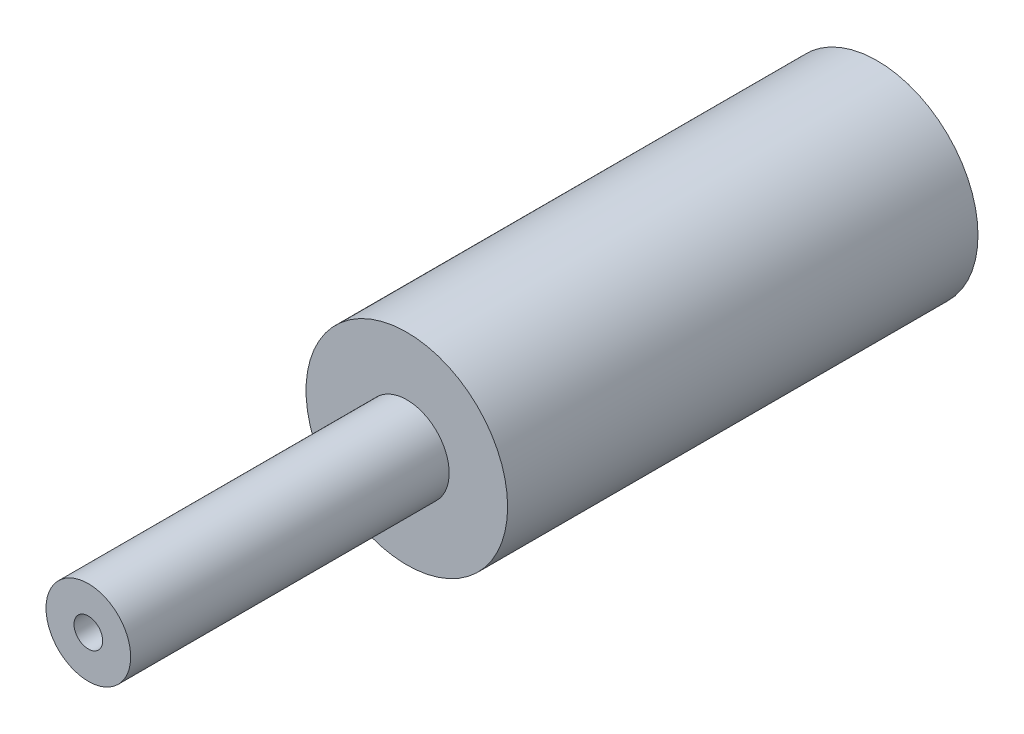
ISO-10303-21;
HEADER;
FILE_DESCRIPTION(('STEP AP214'),'2;1');
FILE_NAME('part.step','',(''),(''),'','','');
FILE_SCHEMA(('AUTOMOTIVE_DESIGN { 1 0 10303 214 1 1 1 1 }'));
ENDSEC;
DATA;
#1=APPLICATION_CONTEXT('core data for automotive mechanical design processes');
#2=APPLICATION_PROTOCOL_DEFINITION('international standard','automotive_design',2000,#1);
#3=PRODUCT_CONTEXT('',#1,'mechanical');
#4=PRODUCT('Part','Part','',(#3));
#5=PRODUCT_RELATED_PRODUCT_CATEGORY('part','',(#4));
#6=PRODUCT_DEFINITION_FORMATION('','',#4);
#7=PRODUCT_DEFINITION_CONTEXT('part definition',#1,'design');
#8=PRODUCT_DEFINITION('design','',#6,#7);
#9=PRODUCT_DEFINITION_SHAPE('','',#8);
#10=(LENGTH_UNIT() NAMED_UNIT(*) SI_UNIT(.MILLI.,.METRE.));
#11=(NAMED_UNIT(*) PLANE_ANGLE_UNIT() SI_UNIT($,.RADIAN.));
#12=(NAMED_UNIT(*) SI_UNIT($,.STERADIAN.) SOLID_ANGLE_UNIT());
#13=UNCERTAINTY_MEASURE_WITH_UNIT(LENGTH_MEASURE(1.E-05),#10,'distance_accuracy_value','');
#14=(GEOMETRIC_REPRESENTATION_CONTEXT(3) GLOBAL_UNCERTAINTY_ASSIGNED_CONTEXT((#13)) GLOBAL_UNIT_ASSIGNED_CONTEXT((#10,
#11,#12)) REPRESENTATION_CONTEXT('',''));
#15=CARTESIAN_POINT('',(0.,0.,0.));
#16=DIRECTION('',(0.,0.,1.));
#17=DIRECTION('',(1.,0.,0.));
#18=AXIS2_PLACEMENT_3D('',#15,#16,#17);
#19=CARTESIAN_POINT('',(0.,0.,44.45));
#20=DIRECTION('',(0.,0.,-1.));
#21=DIRECTION('',(-1.,0.,0.));
#22=AXIS2_PLACEMENT_3D('',#19,#20,#21);
#23=CYLINDRICAL_SURFACE('',#22,9.525);
#24=CARTESIAN_POINT('',(0.,0.,44.45));
#25=DIRECTION('',(0.,0.,1.));
#26=DIRECTION('',(1.,0.,0.));
#27=AXIS2_PLACEMENT_3D('',#24,#25,#26);
#28=CIRCLE('',#27,9.525);
#29=CARTESIAN_POINT('',(9.525,0.,44.45));
#30=VERTEX_POINT('',#29);
#31=EDGE_CURVE('E10',#30,#30,#28,.T.);
#32=ORIENTED_EDGE('',*,*,#31,.F.);
#33=EDGE_LOOP('',(#32));
#34=FACE_BOUND('',#33,.T.);
#35=CARTESIAN_POINT('',(0.,0.,0.));
#36=DIRECTION('',(0.,0.,1.));
#37=DIRECTION('',(1.,0.,0.));
#38=AXIS2_PLACEMENT_3D('',#35,#36,#37);
#39=CIRCLE('',#38,9.525);
#40=CARTESIAN_POINT('',(9.525,0.,0.));
#41=VERTEX_POINT('',#40);
#42=EDGE_CURVE('E33',#41,#41,#39,.T.);
#43=ORIENTED_EDGE('',*,*,#42,.T.);
#44=EDGE_LOOP('',(#43));
#45=FACE_BOUND('',#44,.T.);
#46=ADVANCED_FACE('F30',(#34,#45),#23,.T.);
#47=CARTESIAN_POINT('',(0.,0.,44.45));
#48=DIRECTION('',(0.,0.,1.));
#49=DIRECTION('',(1.,0.,0.));
#50=AXIS2_PLACEMENT_3D('',#47,#48,#49);
#51=PLANE('',#50);
#52=CARTESIAN_POINT('',(0.,0.,44.45));
#53=DIRECTION('',(0.,0.,1.));
#54=DIRECTION('',(1.,0.,0.));
#55=AXIS2_PLACEMENT_3D('',#52,#53,#54);
#56=CIRCLE('',#55,4.);
#57=CARTESIAN_POINT('',(-4.,0.,44.45));
#58=VERTEX_POINT('',#57);
#59=EDGE_CURVE('E42',#58,#58,#56,.T.);
#60=ORIENTED_EDGE('',*,*,#59,.F.);
#61=EDGE_LOOP('',(#60));
#62=FACE_BOUND('',#61,.T.);
#63=ORIENTED_EDGE('',*,*,#31,.T.);
#64=EDGE_LOOP('',(#63));
#65=FACE_BOUND('',#64,.T.);
#66=ADVANCED_FACE('F75',(#62,#65),#51,.T.);
#67=CARTESIAN_POINT('',(0.,0.,0.));
#68=DIRECTION('',(0.,0.,1.));
#69=DIRECTION('',(1.,0.,0.));
#70=AXIS2_PLACEMENT_3D('',#67,#68,#69);
#71=PLANE('',#70);
#72=ORIENTED_EDGE('',*,*,#42,.F.);
#73=EDGE_LOOP('',(#72));
#74=FACE_BOUND('',#73,.T.);
#75=ADVANCED_FACE('F71',(#74),#71,.F.);
#76=CARTESIAN_POINT('',(0.,0.,74.549));
#77=DIRECTION('',(0.,0.,-1.));
#78=DIRECTION('',(-1.,0.,0.));
#79=AXIS2_PLACEMENT_3D('',#76,#77,#78);
#80=CYLINDRICAL_SURFACE('',#79,4.);
#81=CARTESIAN_POINT('',(0.,0.,74.549));
#82=DIRECTION('',(0.,0.,1.));
#83=DIRECTION('',(1.,0.,0.));
#84=AXIS2_PLACEMENT_3D('',#81,#82,#83);
#85=CIRCLE('',#84,4.);
#86=CARTESIAN_POINT('',(-4.,0.,74.549));
#87=VERTEX_POINT('',#86);
#88=EDGE_CURVE('E40',#87,#87,#85,.T.);
#89=CARTESIAN_POINT('',(-4.,0.,74.549));
#90=CARTESIAN_POINT('',(-4.,0.,74.23546875));
#91=CARTESIAN_POINT('',(-4.,0.,73.9219375));
#92=CARTESIAN_POINT('',(-4.,0.,73.294875));
#93=CARTESIAN_POINT('',(-4.,0.,72.98134375));
#94=CARTESIAN_POINT('',(-4.,0.,72.35428125));
#95=CARTESIAN_POINT('',(-4.,0.,72.04075));
#96=CARTESIAN_POINT('',(-4.,0.,71.4136875));
#97=CARTESIAN_POINT('',(-4.,0.,71.10015625));
#98=CARTESIAN_POINT('',(-4.,0.,70.47309375));
#99=CARTESIAN_POINT('',(-4.,0.,70.1595625));
#100=CARTESIAN_POINT('',(-4.,0.,69.5325));
#101=CARTESIAN_POINT('',(-4.,0.,69.21896875));
#102=CARTESIAN_POINT('',(-4.,0.,68.59190625));
#103=CARTESIAN_POINT('',(-4.,0.,68.278375));
#104=CARTESIAN_POINT('',(-4.,0.,67.6513125));
#105=CARTESIAN_POINT('',(-4.,0.,67.33778125));
#106=CARTESIAN_POINT('',(-4.,0.,66.71071875));
#107=CARTESIAN_POINT('',(-4.,0.,66.3971875));
#108=CARTESIAN_POINT('',(-4.,0.,65.770125));
#109=CARTESIAN_POINT('',(-4.,0.,65.45659375));
#110=CARTESIAN_POINT('',(-4.,0.,64.82953125));
#111=CARTESIAN_POINT('',(-4.,0.,64.516));
#112=CARTESIAN_POINT('',(-4.,0.,63.8889375));
#113=CARTESIAN_POINT('',(-4.,0.,63.57540625));
#114=CARTESIAN_POINT('',(-4.,0.,62.94834375));
#115=CARTESIAN_POINT('',(-4.,0.,62.6348125));
#116=CARTESIAN_POINT('',(-4.,0.,62.00775));
#117=CARTESIAN_POINT('',(-4.,0.,61.69421875));
#118=CARTESIAN_POINT('',(-4.,0.,61.06715625));
#119=CARTESIAN_POINT('',(-4.,0.,60.753625));
#120=CARTESIAN_POINT('',(-4.,0.,60.1265625));
#121=CARTESIAN_POINT('',(-4.,0.,59.81303125));
#122=CARTESIAN_POINT('',(-4.,0.,59.18596875));
#123=CARTESIAN_POINT('',(-4.,0.,58.8724375));
#124=CARTESIAN_POINT('',(-4.,0.,58.245375));
#125=CARTESIAN_POINT('',(-4.,0.,57.93184375));
#126=CARTESIAN_POINT('',(-4.,0.,57.30478125));
#127=CARTESIAN_POINT('',(-4.,0.,56.99125));
#128=CARTESIAN_POINT('',(-4.,0.,56.3641875));
#129=CARTESIAN_POINT('',(-4.,0.,56.05065625));
#130=CARTESIAN_POINT('',(-4.,0.,55.42359375));
#131=CARTESIAN_POINT('',(-4.,0.,55.1100625));
#132=CARTESIAN_POINT('',(-4.,0.,54.483));
#133=CARTESIAN_POINT('',(-4.,0.,54.16946875));
#134=CARTESIAN_POINT('',(-4.,0.,53.54240625));
#135=CARTESIAN_POINT('',(-4.,0.,53.228875));
#136=CARTESIAN_POINT('',(-4.,0.,52.6018125));
#137=CARTESIAN_POINT('',(-4.,0.,52.28828125));
#138=CARTESIAN_POINT('',(-4.,0.,51.66121875));
#139=CARTESIAN_POINT('',(-4.,0.,51.3476875));
#140=CARTESIAN_POINT('',(-4.,0.,50.720625));
#141=CARTESIAN_POINT('',(-4.,0.,50.40709375));
#142=CARTESIAN_POINT('',(-4.,0.,49.78003125));
#143=CARTESIAN_POINT('',(-4.,0.,49.4665));
#144=CARTESIAN_POINT('',(-4.,0.,48.8394375));
#145=CARTESIAN_POINT('',(-4.,0.,48.52590625));
#146=CARTESIAN_POINT('',(-4.,0.,47.89884375));
#147=CARTESIAN_POINT('',(-4.,0.,47.5853125));
#148=CARTESIAN_POINT('',(-4.,0.,46.95825));
#149=CARTESIAN_POINT('',(-4.,0.,46.64471875));
#150=CARTESIAN_POINT('',(-4.,0.,46.01765625));
#151=CARTESIAN_POINT('',(-4.,0.,45.704125));
#152=CARTESIAN_POINT('',(-4.,0.,45.0770625));
#153=CARTESIAN_POINT('',(-4.,0.,44.76353125));
#154=CARTESIAN_POINT('',(-4.,0.,44.45));
#155=B_SPLINE_CURVE_WITH_KNOTS('',3,(#89,#90,#91,#92,#93,#94,#95,#96,#97,#98,#99,#100,#101,#102,
#103,#104,#105,#106,#107,#108,#109,#110,#111,#112,#113,#114,#115,#116,#117,#118,#119,#120,#121,
#122,#123,#124,#125,#126,#127,#128,#129,#130,#131,#132,#133,#134,#135,#136,#137,#138,#139,#140,
#141,#142,#143,#144,#145,#146,#147,#148,#149,#150,#151,#152,#153,#154),.UNSPECIFIED.,.F.,.F.,(4,
2,2,2,2,2,2,2,2,2,2,2,2,2,2,2,2,2,2,2,2,2,2,2,2,2,2,2,2,2,2,2,4),(0.,0.94059375000001,
1.88118750000001,2.82178125,3.76237500000001,4.70296875000001,5.6435625,6.58415625,
7.52475000000001,8.46534375000001,9.4059375,10.34653125,11.287125,12.22771875,13.1683125,
14.10890625,15.0495,15.99009375,16.9306875,17.87128125,18.811875,19.75246875,20.6930625,
21.63365625,22.57425,23.51484375,24.4554375,25.39603125,26.336625,27.27721875,28.2178125,
29.15840625,30.099),.UNSPECIFIED.);
#156=EDGE_CURVE('BSEAM65',#87,#58,#155,.T.);
#157=ORIENTED_EDGE('',*,*,#88,.F.);
#158=ORIENTED_EDGE('',*,*,#59,.T.);
#159=ORIENTED_EDGE('',*,*,#156,.T.);
#160=ORIENTED_EDGE('',*,*,#156,.F.);
#161=EDGE_LOOP('',(#157,#159,#158,#160));
#162=FACE_BOUND('',#161,.T.);
#163=ADVANCED_FACE('F65',(#162),#80,.T.);
#164=CARTESIAN_POINT('',(0.,0.,74.549));
#165=DIRECTION('',(0.,0.,1.));
#166=DIRECTION('',(1.,0.,0.));
#167=AXIS2_PLACEMENT_3D('',#164,#165,#166);
#168=PLANE('',#167);
#169=CARTESIAN_POINT('',(0.,0.,74.549));
#170=DIRECTION('',(0.,0.,1.));
#171=DIRECTION('',(1.,0.,0.));
#172=AXIS2_PLACEMENT_3D('',#169,#170,#171);
#173=CIRCLE('',#172,1.35255);
#174=CARTESIAN_POINT('',(1.35255,0.,74.549));
#175=VERTEX_POINT('',#174);
#176=EDGE_CURVE('E48',#175,#175,#173,.T.);
#177=ORIENTED_EDGE('',*,*,#176,.F.);
#178=EDGE_LOOP('',(#177));
#179=FACE_BOUND('',#178,.T.);
#180=ORIENTED_EDGE('',*,*,#88,.T.);
#181=EDGE_LOOP('',(#180));
#182=FACE_BOUND('',#181,.T.);
#183=ADVANCED_FACE('F59',(#179,#182),#168,.T.);
#184=CARTESIAN_POINT('',(0.,0.,56.769));
#185=DIRECTION('',(0.,0.,1.));
#186=DIRECTION('',(1.,0.,0.));
#187=AXIS2_PLACEMENT_3D('',#184,#185,#186);
#188=CYLINDRICAL_SURFACE('',#187,1.35255);
#189=CARTESIAN_POINT('',(0.,0.,56.769));
#190=DIRECTION('',(0.,0.,1.));
#191=DIRECTION('',(1.,0.,0.));
#192=AXIS2_PLACEMENT_3D('',#189,#190,#191);
#193=CIRCLE('',#192,1.35255);
#194=CARTESIAN_POINT('',(1.35255,0.,56.769));
#195=VERTEX_POINT('',#194);
#196=EDGE_CURVE('E45',#195,#195,#193,.T.);
#197=ORIENTED_EDGE('',*,*,#196,.F.);
#198=EDGE_LOOP('',(#197));
#199=FACE_BOUND('',#198,.T.);
#200=ORIENTED_EDGE('',*,*,#176,.T.);
#201=EDGE_LOOP('',(#200));
#202=FACE_BOUND('',#201,.T.);
#203=ADVANCED_FACE('F56',(#199,#202),#188,.F.);
#204=CARTESIAN_POINT('',(0.,0.,56.769));
#205=DIRECTION('',(0.,0.,1.));
#206=DIRECTION('',(1.,0.,0.));
#207=AXIS2_PLACEMENT_3D('',#204,#205,#206);
#208=PLANE('',#207);
#209=ORIENTED_EDGE('',*,*,#196,.T.);
#210=EDGE_LOOP('',(#209));
#211=FACE_BOUND('',#210,.T.);
#212=ADVANCED_FACE('F54',(#211),#208,.T.);
#213=CLOSED_SHELL('',(#46,#66,#75,#163,#183,#203,#212));
#214=MANIFOLD_SOLID_BREP('B2',#213);
#215=ADVANCED_BREP_SHAPE_REPRESENTATION('',(#18,#214),#14);
#216=SHAPE_DEFINITION_REPRESENTATION(#9,#215);
ENDSEC;
END-ISO-10303-21;
